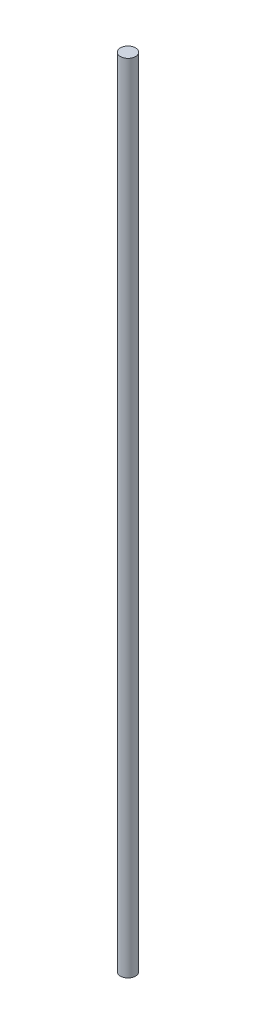
ISO-10303-21;
HEADER;
FILE_DESCRIPTION(('STEP AP214'),'2;1');
FILE_NAME('part.step','',(''),(''),'','','');
FILE_SCHEMA(('AUTOMOTIVE_DESIGN { 1 0 10303 214 1 1 1 1 }'));
ENDSEC;
DATA;
#1=APPLICATION_CONTEXT('core data for automotive mechanical design processes');
#2=APPLICATION_PROTOCOL_DEFINITION('international standard','automotive_design',2000,#1);
#3=PRODUCT_CONTEXT('',#1,'mechanical');
#4=PRODUCT('Part','Part','',(#3));
#5=PRODUCT_RELATED_PRODUCT_CATEGORY('part','',(#4));
#6=PRODUCT_DEFINITION_FORMATION('','',#4);
#7=PRODUCT_DEFINITION_CONTEXT('part definition',#1,'design');
#8=PRODUCT_DEFINITION('design','',#6,#7);
#9=PRODUCT_DEFINITION_SHAPE('','',#8);
#10=(LENGTH_UNIT() NAMED_UNIT(*) SI_UNIT(.MILLI.,.METRE.));
#11=(NAMED_UNIT(*) PLANE_ANGLE_UNIT() SI_UNIT($,.RADIAN.));
#12=(NAMED_UNIT(*) SI_UNIT($,.STERADIAN.) SOLID_ANGLE_UNIT());
#13=UNCERTAINTY_MEASURE_WITH_UNIT(LENGTH_MEASURE(1.E-05),#10,'distance_accuracy_value','');
#14=(GEOMETRIC_REPRESENTATION_CONTEXT(3) GLOBAL_UNCERTAINTY_ASSIGNED_CONTEXT((#13)) GLOBAL_UNIT_ASSIGNED_CONTEXT((#10,
#11,#12)) REPRESENTATION_CONTEXT('',''));
#15=CARTESIAN_POINT('',(0.,0.,0.));
#16=DIRECTION('',(0.,0.,1.));
#17=DIRECTION('',(1.,0.,0.));
#18=AXIS2_PLACEMENT_3D('',#15,#16,#17);
#19=CARTESIAN_POINT('',(0.,431.31370849898,0.));
#20=DIRECTION('',(0.,-1.,0.));
#21=DIRECTION('',(0.,0.,-1.));
#22=AXIS2_PLACEMENT_3D('',#19,#20,#21);
#23=CYLINDRICAL_SURFACE('',#22,4.);
#24=CARTESIAN_POINT('',(0.,0.,0.));
#25=DIRECTION('',(0.,1.,0.));
#26=DIRECTION('',(0.,0.,1.));
#27=AXIS2_PLACEMENT_3D('',#24,#25,#26);
#28=CIRCLE('',#27,4.);
#29=CARTESIAN_POINT('',(0.,0.,4.));
#30=VERTEX_POINT('',#29);
#31=EDGE_CURVE('E46',#30,#30,#28,.T.);
#32=ORIENTED_EDGE('',*,*,#31,.T.);
#33=EDGE_LOOP('',(#32));
#34=FACE_BOUND('',#33,.T.);
#35=CARTESIAN_POINT('',(0.,419.999999999996,0.));
#36=DIRECTION('',(0.,1.,0.));
#37=DIRECTION('',(-1.,0.,0.));
#38=AXIS2_PLACEMENT_3D('',#35,#36,#37);
#39=CIRCLE('',#38,4.);
#40=CARTESIAN_POINT('',(-4.,419.999999999996,0.));
#41=VERTEX_POINT('',#40);
#42=EDGE_CURVE('E10',#41,#41,#39,.T.);
#43=ORIENTED_EDGE('',*,*,#42,.F.);
#44=EDGE_LOOP('',(#43));
#45=FACE_BOUND('',#44,.T.);
#46=ADVANCED_FACE('F39',(#34,#45),#23,.T.);
#47=CARTESIAN_POINT('',(0.,0.,0.));
#48=DIRECTION('',(0.,1.,0.));
#49=DIRECTION('',(0.,0.,1.));
#50=AXIS2_PLACEMENT_3D('',#47,#48,#49);
#51=PLANE('',#50);
#52=ORIENTED_EDGE('',*,*,#31,.F.);
#53=EDGE_LOOP('',(#52));
#54=FACE_BOUND('',#53,.T.);
#55=ADVANCED_FACE('F54',(#54),#51,.F.);
#56=CARTESIAN_POINT('',(38.9909319032127,419.999999999996,-51.613634141753));
#57=DIRECTION('',(0.,1.,0.));
#58=DIRECTION('',(0.841280171038344,0.,0.540599365350806));
#59=AXIS2_PLACEMENT_3D('',#56,#57,#58);
#60=PLANE('',#59);
#61=ORIENTED_EDGE('',*,*,#42,.T.);
#62=EDGE_LOOP('',(#61));
#63=FACE_BOUND('',#62,.T.);
#64=ADVANCED_FACE('F41',(#63),#60,.T.);
#65=CLOSED_SHELL('',(#46,#55,#64));
#66=MANIFOLD_SOLID_BREP('B2',#65);
#67=ADVANCED_BREP_SHAPE_REPRESENTATION('',(#18,#66),#14);
#68=SHAPE_DEFINITION_REPRESENTATION(#9,#67);
ENDSEC;
END-ISO-10303-21;
